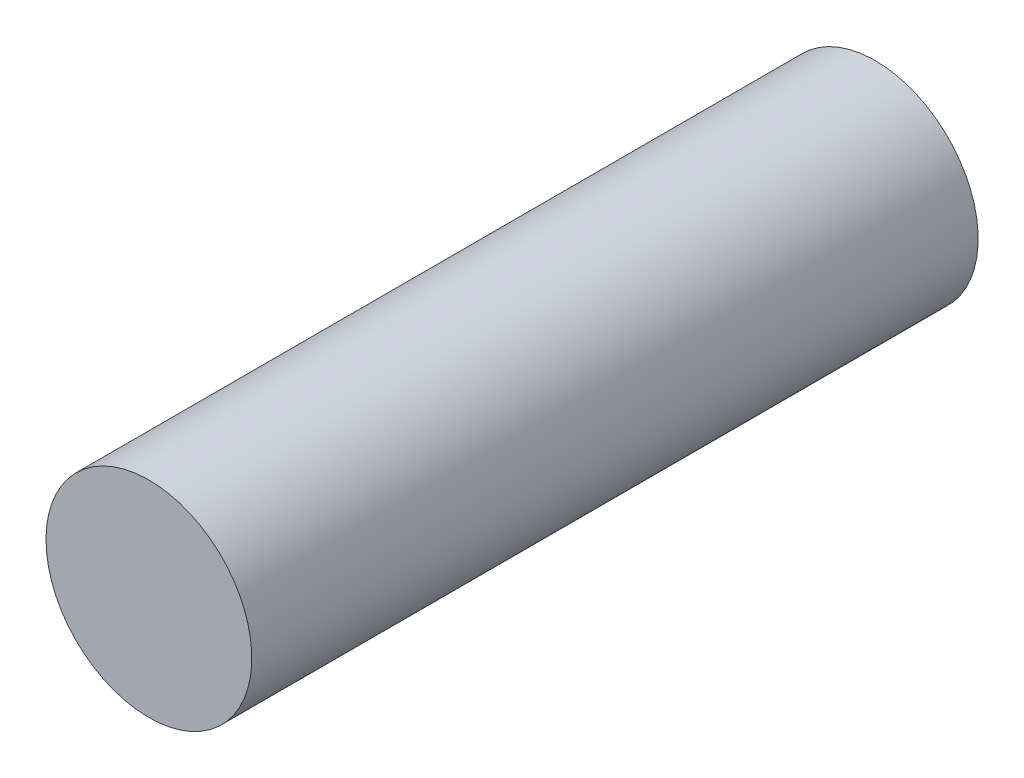
ISO-10303-21;
HEADER;
FILE_DESCRIPTION(('STEP AP214'),'2;1');
FILE_NAME('part.step','',(''),(''),'','','');
FILE_SCHEMA(('AUTOMOTIVE_DESIGN { 1 0 10303 214 1 1 1 1 }'));
ENDSEC;
DATA;
#1=APPLICATION_CONTEXT('core data for automotive mechanical design processes');
#2=APPLICATION_PROTOCOL_DEFINITION('international standard','automotive_design',2000,#1);
#3=PRODUCT_CONTEXT('',#1,'mechanical');
#4=PRODUCT('Part','Part','',(#3));
#5=PRODUCT_RELATED_PRODUCT_CATEGORY('part','',(#4));
#6=PRODUCT_DEFINITION_FORMATION('','',#4);
#7=PRODUCT_DEFINITION_CONTEXT('part definition',#1,'design');
#8=PRODUCT_DEFINITION('design','',#6,#7);
#9=PRODUCT_DEFINITION_SHAPE('','',#8);
#10=(LENGTH_UNIT() NAMED_UNIT(*) SI_UNIT(.MILLI.,.METRE.));
#11=(NAMED_UNIT(*) PLANE_ANGLE_UNIT() SI_UNIT($,.RADIAN.));
#12=(NAMED_UNIT(*) SI_UNIT($,.STERADIAN.) SOLID_ANGLE_UNIT());
#13=UNCERTAINTY_MEASURE_WITH_UNIT(LENGTH_MEASURE(1.E-05),#10,'distance_accuracy_value','');
#14=(GEOMETRIC_REPRESENTATION_CONTEXT(3) GLOBAL_UNCERTAINTY_ASSIGNED_CONTEXT((#13)) GLOBAL_UNIT_ASSIGNED_CONTEXT((#10,
#11,#12)) REPRESENTATION_CONTEXT('',''));
#15=CARTESIAN_POINT('',(0.,0.,0.));
#16=DIRECTION('',(0.,0.,1.));
#17=DIRECTION('',(1.,0.,0.));
#18=AXIS2_PLACEMENT_3D('',#15,#16,#17);
#19=CARTESIAN_POINT('',(0.,0.,90.));
#20=DIRECTION('',(0.,0.,-1.));
#21=DIRECTION('',(-1.,0.,0.));
#22=AXIS2_PLACEMENT_3D('',#19,#20,#21);
#23=CYLINDRICAL_SURFACE('',#22,12.75);
#24=CARTESIAN_POINT('',(0.,0.,90.));
#25=DIRECTION('',(0.,0.,1.));
#26=DIRECTION('',(1.,0.,0.));
#27=AXIS2_PLACEMENT_3D('',#24,#25,#26);
#28=CIRCLE('',#27,12.75);
#29=CARTESIAN_POINT('',(-12.75,0.,90.));
#30=VERTEX_POINT('',#29);
#31=EDGE_CURVE('E10',#30,#30,#28,.T.);
#32=CARTESIAN_POINT('',(0.,0.,0.));
#33=DIRECTION('',(0.,0.,1.));
#34=DIRECTION('',(1.,0.,0.));
#35=AXIS2_PLACEMENT_3D('',#32,#33,#34);
#36=CIRCLE('',#35,12.75);
#37=CARTESIAN_POINT('',(-12.75,0.,0.));
#38=VERTEX_POINT('',#37);
#39=EDGE_CURVE('E33',#38,#38,#36,.T.);
#40=CARTESIAN_POINT('',(-12.75,0.,90.));
#41=CARTESIAN_POINT('',(-12.75,0.,89.0625));
#42=CARTESIAN_POINT('',(-12.75,0.,88.125));
#43=CARTESIAN_POINT('',(-12.75,0.,86.25));
#44=CARTESIAN_POINT('',(-12.75,0.,85.3125));
#45=CARTESIAN_POINT('',(-12.75,0.,83.4375));
#46=CARTESIAN_POINT('',(-12.75,0.,82.5));
#47=CARTESIAN_POINT('',(-12.75,0.,80.625));
#48=CARTESIAN_POINT('',(-12.75,0.,79.6875));
#49=CARTESIAN_POINT('',(-12.75,0.,77.8125));
#50=CARTESIAN_POINT('',(-12.75,0.,76.875));
#51=CARTESIAN_POINT('',(-12.75,0.,75.));
#52=CARTESIAN_POINT('',(-12.75,0.,74.0625));
#53=CARTESIAN_POINT('',(-12.75,0.,72.1875));
#54=CARTESIAN_POINT('',(-12.75,0.,71.25));
#55=CARTESIAN_POINT('',(-12.75,0.,69.375));
#56=CARTESIAN_POINT('',(-12.75,0.,68.4375));
#57=CARTESIAN_POINT('',(-12.75,0.,66.5625));
#58=CARTESIAN_POINT('',(-12.75,0.,65.625));
#59=CARTESIAN_POINT('',(-12.75,0.,63.75));
#60=CARTESIAN_POINT('',(-12.75,0.,62.8125));
#61=CARTESIAN_POINT('',(-12.75,0.,60.9375));
#62=CARTESIAN_POINT('',(-12.75,0.,60.));
#63=CARTESIAN_POINT('',(-12.75,0.,58.125));
#64=CARTESIAN_POINT('',(-12.75,0.,57.1875));
#65=CARTESIAN_POINT('',(-12.75,0.,55.3125));
#66=CARTESIAN_POINT('',(-12.75,0.,54.375));
#67=CARTESIAN_POINT('',(-12.75,0.,52.5));
#68=CARTESIAN_POINT('',(-12.75,0.,51.5625));
#69=CARTESIAN_POINT('',(-12.75,0.,49.6875));
#70=CARTESIAN_POINT('',(-12.75,0.,48.75));
#71=CARTESIAN_POINT('',(-12.75,0.,46.875));
#72=CARTESIAN_POINT('',(-12.75,0.,45.9375));
#73=CARTESIAN_POINT('',(-12.75,0.,44.0625));
#74=CARTESIAN_POINT('',(-12.75,0.,43.125));
#75=CARTESIAN_POINT('',(-12.75,0.,41.25));
#76=CARTESIAN_POINT('',(-12.75,0.,40.3125));
#77=CARTESIAN_POINT('',(-12.75,0.,38.4375));
#78=CARTESIAN_POINT('',(-12.75,0.,37.5));
#79=CARTESIAN_POINT('',(-12.75,0.,35.625));
#80=CARTESIAN_POINT('',(-12.75,0.,34.6875));
#81=CARTESIAN_POINT('',(-12.75,0.,32.8125));
#82=CARTESIAN_POINT('',(-12.75,0.,31.875));
#83=CARTESIAN_POINT('',(-12.75,0.,30.));
#84=CARTESIAN_POINT('',(-12.75,0.,29.0625));
#85=CARTESIAN_POINT('',(-12.75,0.,27.1875));
#86=CARTESIAN_POINT('',(-12.75,0.,26.25));
#87=CARTESIAN_POINT('',(-12.75,0.,24.375));
#88=CARTESIAN_POINT('',(-12.75,0.,23.4375));
#89=CARTESIAN_POINT('',(-12.75,0.,21.5625));
#90=CARTESIAN_POINT('',(-12.75,0.,20.625));
#91=CARTESIAN_POINT('',(-12.75,0.,18.75));
#92=CARTESIAN_POINT('',(-12.75,0.,17.8125));
#93=CARTESIAN_POINT('',(-12.75,0.,15.9375));
#94=CARTESIAN_POINT('',(-12.75,0.,15.));
#95=CARTESIAN_POINT('',(-12.75,0.,13.125));
#96=CARTESIAN_POINT('',(-12.75,0.,12.1875));
#97=CARTESIAN_POINT('',(-12.75,0.,10.3125));
#98=CARTESIAN_POINT('',(-12.75,0.,9.37499999999999));
#99=CARTESIAN_POINT('',(-12.75,0.,7.49999999999999));
#100=CARTESIAN_POINT('',(-12.75,0.,6.56249999999999));
#101=CARTESIAN_POINT('',(-12.75,0.,4.68749999999999));
#102=CARTESIAN_POINT('',(-12.75,0.,3.74999999999998));
#103=CARTESIAN_POINT('',(-12.75,0.,1.87499999999998));
#104=CARTESIAN_POINT('',(-12.75,0.,0.937499999999986));
#105=CARTESIAN_POINT('',(-12.75,0.,0.));
#106=B_SPLINE_CURVE_WITH_KNOTS('',3,(#40,#41,#42,#43,#44,#45,#46,#47,#48,#49,#50,#51,#52,#53,
#54,#55,#56,#57,#58,#59,#60,#61,#62,#63,#64,#65,#66,#67,#68,#69,#70,#71,#72,#73,#74,#75,#76,#77,
#78,#79,#80,#81,#82,#83,#84,#85,#86,#87,#88,#89,#90,#91,#92,#93,#94,#95,#96,#97,#98,#99,#100,
#101,#102,#103,#104,#105),.UNSPECIFIED.,.F.,.F.,(4,2,2,2,2,2,2,2,2,2,2,2,2,2,2,2,2,2,2,2,2,2,2,
2,2,2,2,2,2,2,2,2,4),(0.,2.8125,5.62499999999999,8.43749999999999,11.25,14.0625,16.875,19.6875,
22.5,25.3125,28.125,30.9375,33.75,36.5625,39.375,42.1875,45.,47.8125,50.625,53.4375,56.25,
59.0625,61.875,64.6875,67.5,70.3125,73.125,75.9375,78.75,81.5625,84.375,87.1875,90.),.UNSPECIFIED.);
#107=EDGE_CURVE('BSEAM30',#30,#38,#106,.T.);
#108=ORIENTED_EDGE('',*,*,#31,.F.);
#109=ORIENTED_EDGE('',*,*,#39,.T.);
#110=ORIENTED_EDGE('',*,*,#107,.T.);
#111=ORIENTED_EDGE('',*,*,#107,.F.);
#112=EDGE_LOOP('',(#108,#110,#109,#111));
#113=FACE_BOUND('',#112,.T.);
#114=ADVANCED_FACE('F30',(#113),#23,.T.);
#115=CARTESIAN_POINT('',(0.,0.,90.));
#116=DIRECTION('',(0.,0.,1.));
#117=DIRECTION('',(1.,0.,0.));
#118=AXIS2_PLACEMENT_3D('',#115,#116,#117);
#119=PLANE('',#118);
#120=ORIENTED_EDGE('',*,*,#31,.T.);
#121=EDGE_LOOP('',(#120));
#122=FACE_BOUND('',#121,.T.);
#123=ADVANCED_FACE('F45',(#122),#119,.T.);
#124=CARTESIAN_POINT('',(0.,0.,0.));
#125=DIRECTION('',(0.,0.,1.));
#126=DIRECTION('',(1.,0.,0.));
#127=AXIS2_PLACEMENT_3D('',#124,#125,#126);
#128=PLANE('',#127);
#129=ORIENTED_EDGE('',*,*,#39,.F.);
#130=EDGE_LOOP('',(#129));
#131=FACE_BOUND('',#130,.T.);
#132=ADVANCED_FACE('F43',(#131),#128,.F.);
#133=CLOSED_SHELL('',(#114,#123,#132));
#134=MANIFOLD_SOLID_BREP('B2',#133);
#135=ADVANCED_BREP_SHAPE_REPRESENTATION('',(#18,#134),#14);
#136=SHAPE_DEFINITION_REPRESENTATION(#9,#135);
ENDSEC;
END-ISO-10303-21;
